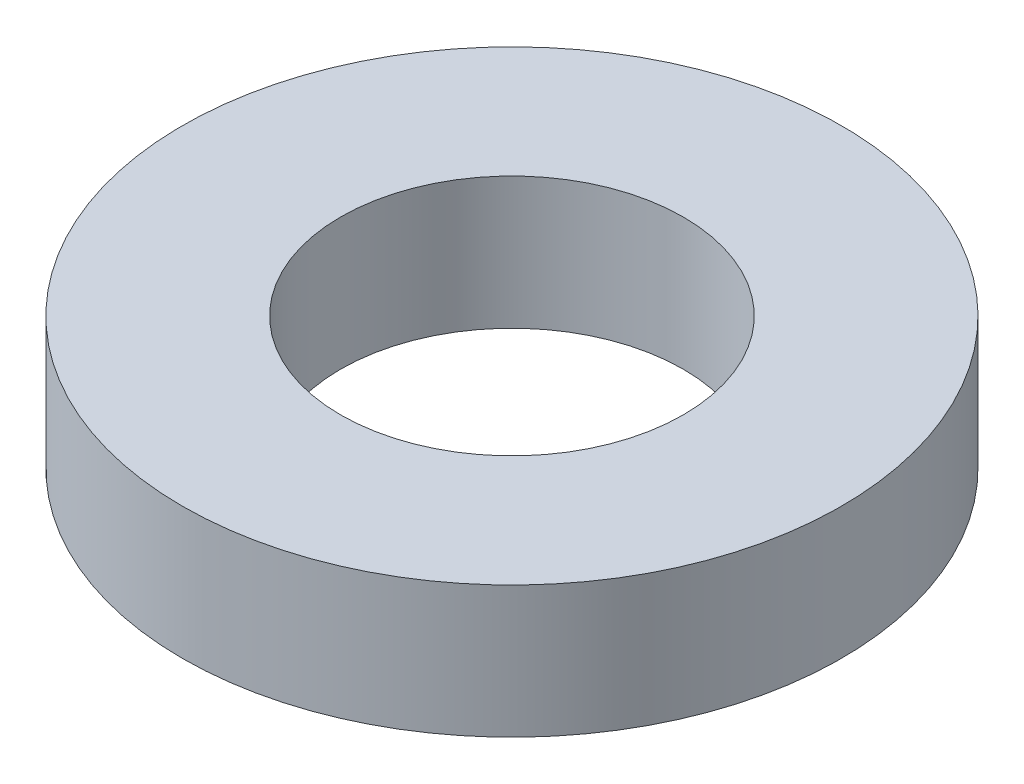
ISO-10303-21;
HEADER;
FILE_DESCRIPTION(('STEP AP214'),'2;1');
FILE_NAME('part.step','',(''),(''),'','','');
FILE_SCHEMA(('AUTOMOTIVE_DESIGN { 1 0 10303 214 1 1 1 1 }'));
ENDSEC;
DATA;
#1=APPLICATION_CONTEXT('core data for automotive mechanical design processes');
#2=APPLICATION_PROTOCOL_DEFINITION('international standard','automotive_design',2000,#1);
#3=PRODUCT_CONTEXT('',#1,'mechanical');
#4=PRODUCT('Part','Part','',(#3));
#5=PRODUCT_RELATED_PRODUCT_CATEGORY('part','',(#4));
#6=PRODUCT_DEFINITION_FORMATION('','',#4);
#7=PRODUCT_DEFINITION_CONTEXT('part definition',#1,'design');
#8=PRODUCT_DEFINITION('design','',#6,#7);
#9=PRODUCT_DEFINITION_SHAPE('','',#8);
#10=(LENGTH_UNIT() NAMED_UNIT(*) SI_UNIT(.MILLI.,.METRE.));
#11=(NAMED_UNIT(*) PLANE_ANGLE_UNIT() SI_UNIT($,.RADIAN.));
#12=(NAMED_UNIT(*) SI_UNIT($,.STERADIAN.) SOLID_ANGLE_UNIT());
#13=UNCERTAINTY_MEASURE_WITH_UNIT(LENGTH_MEASURE(1.E-05),#10,'distance_accuracy_value','');
#14=(GEOMETRIC_REPRESENTATION_CONTEXT(3) GLOBAL_UNCERTAINTY_ASSIGNED_CONTEXT((#13)) GLOBAL_UNIT_ASSIGNED_CONTEXT((#10,
#11,#12)) REPRESENTATION_CONTEXT('',''));
#15=CARTESIAN_POINT('',(0.,0.,0.));
#16=DIRECTION('',(0.,0.,1.));
#17=DIRECTION('',(1.,0.,0.));
#18=AXIS2_PLACEMENT_3D('',#15,#16,#17);
#19=CARTESIAN_POINT('',(0.,1.25,0.));
#20=DIRECTION('',(0.,1.,0.));
#21=DIRECTION('',(0.,0.,1.));
#22=AXIS2_PLACEMENT_3D('',#19,#20,#21);
#23=PLANE('',#22);
#24=CARTESIAN_POINT('',(0.,1.25,0.));
#25=DIRECTION('',(0.,1.,0.));
#26=DIRECTION('',(0.,0.,1.));
#27=AXIS2_PLACEMENT_3D('',#24,#25,#26);
#28=CIRCLE('',#27,3.125);
#29=CARTESIAN_POINT('',(0.,1.25,3.125));
#30=VERTEX_POINT('',#29);
#31=EDGE_CURVE('E10',#30,#30,#28,.T.);
#32=ORIENTED_EDGE('',*,*,#31,.T.);
#33=EDGE_LOOP('',(#32));
#34=FACE_BOUND('',#33,.T.);
#35=CARTESIAN_POINT('',(0.,1.25,0.));
#36=DIRECTION('',(0.,1.,0.));
#37=DIRECTION('',(0.,0.,1.));
#38=AXIS2_PLACEMENT_3D('',#35,#36,#37);
#39=CIRCLE('',#38,1.625);
#40=CARTESIAN_POINT('',(0.,1.25,1.625));
#41=VERTEX_POINT('',#40);
#42=EDGE_CURVE('E53',#41,#41,#39,.T.);
#43=ORIENTED_EDGE('',*,*,#42,.F.);
#44=EDGE_LOOP('',(#43));
#45=FACE_BOUND('',#44,.T.);
#46=ADVANCED_FACE('F39',(#34,#45),#23,.T.);
#47=CARTESIAN_POINT('',(0.,0.,0.));
#48=DIRECTION('',(0.,1.,0.));
#49=DIRECTION('',(0.,0.,1.));
#50=AXIS2_PLACEMENT_3D('',#47,#48,#49);
#51=PLANE('',#50);
#52=CARTESIAN_POINT('',(0.,0.,0.));
#53=DIRECTION('',(0.,1.,0.));
#54=DIRECTION('',(0.,0.,1.));
#55=AXIS2_PLACEMENT_3D('',#52,#53,#54);
#56=CIRCLE('',#55,3.125);
#57=CARTESIAN_POINT('',(0.,0.,3.125));
#58=VERTEX_POINT('',#57);
#59=EDGE_CURVE('E43',#58,#58,#56,.T.);
#60=ORIENTED_EDGE('',*,*,#59,.F.);
#61=EDGE_LOOP('',(#60));
#62=FACE_BOUND('',#61,.T.);
#63=CARTESIAN_POINT('',(0.,0.,0.));
#64=DIRECTION('',(0.,1.,0.));
#65=DIRECTION('',(0.,0.,1.));
#66=AXIS2_PLACEMENT_3D('',#63,#64,#65);
#67=CIRCLE('',#66,1.625);
#68=CARTESIAN_POINT('',(0.,0.,1.625));
#69=VERTEX_POINT('',#68);
#70=EDGE_CURVE('E55',#69,#69,#67,.T.);
#71=ORIENTED_EDGE('',*,*,#70,.T.);
#72=EDGE_LOOP('',(#71));
#73=FACE_BOUND('',#72,.T.);
#74=ADVANCED_FACE('F66',(#62,#73),#51,.F.);
#75=CARTESIAN_POINT('',(0.,1.25,0.));
#76=DIRECTION('',(0.,-1.,0.));
#77=DIRECTION('',(0.,0.,-1.));
#78=AXIS2_PLACEMENT_3D('',#75,#76,#77);
#79=CYLINDRICAL_SURFACE('',#78,3.125);
#80=ORIENTED_EDGE('',*,*,#31,.F.);
#81=EDGE_LOOP('',(#80));
#82=FACE_BOUND('',#81,.T.);
#83=ORIENTED_EDGE('',*,*,#59,.T.);
#84=EDGE_LOOP('',(#83));
#85=FACE_BOUND('',#84,.T.);
#86=ADVANCED_FACE('F41',(#82,#85),#79,.T.);
#87=CARTESIAN_POINT('',(0.,1.25,0.));
#88=DIRECTION('',(0.,-1.,0.));
#89=DIRECTION('',(0.,0.,-1.));
#90=AXIS2_PLACEMENT_3D('',#87,#88,#89);
#91=CYLINDRICAL_SURFACE('',#90,1.625);
#92=ORIENTED_EDGE('',*,*,#42,.T.);
#93=EDGE_LOOP('',(#92));
#94=FACE_BOUND('',#93,.T.);
#95=ORIENTED_EDGE('',*,*,#70,.F.);
#96=EDGE_LOOP('',(#95));
#97=FACE_BOUND('',#96,.T.);
#98=ADVANCED_FACE('F62',(#94,#97),#91,.F.);
#99=CLOSED_SHELL('',(#46,#74,#86,#98));
#100=MANIFOLD_SOLID_BREP('B2',#99);
#101=ADVANCED_BREP_SHAPE_REPRESENTATION('',(#18,#100),#14);
#102=SHAPE_DEFINITION_REPRESENTATION(#9,#101);
ENDSEC;
END-ISO-10303-21;
